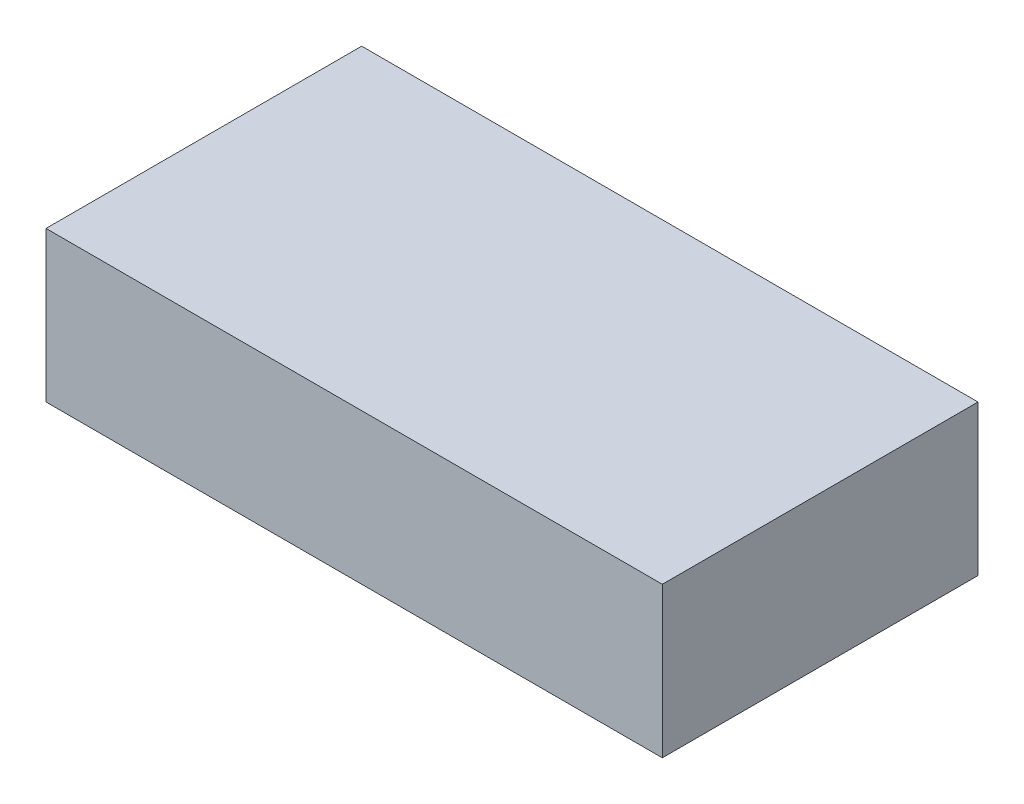
ISO-10303-21;
HEADER;
FILE_DESCRIPTION(('STEP AP214'),'2;1');
FILE_NAME('part.step','',(''),(''),'','','');
FILE_SCHEMA(('AUTOMOTIVE_DESIGN { 1 0 10303 214 1 1 1 1 }'));
ENDSEC;
DATA;
#1=APPLICATION_CONTEXT('core data for automotive mechanical design processes');
#2=APPLICATION_PROTOCOL_DEFINITION('international standard','automotive_design',2000,#1);
#3=PRODUCT_CONTEXT('',#1,'mechanical');
#4=PRODUCT('Part','Part','',(#3));
#5=PRODUCT_RELATED_PRODUCT_CATEGORY('part','',(#4));
#6=PRODUCT_DEFINITION_FORMATION('','',#4);
#7=PRODUCT_DEFINITION_CONTEXT('part definition',#1,'design');
#8=PRODUCT_DEFINITION('design','',#6,#7);
#9=PRODUCT_DEFINITION_SHAPE('','',#8);
#10=(LENGTH_UNIT() NAMED_UNIT(*) SI_UNIT(.MILLI.,.METRE.));
#11=(NAMED_UNIT(*) PLANE_ANGLE_UNIT() SI_UNIT($,.RADIAN.));
#12=(NAMED_UNIT(*) SI_UNIT($,.STERADIAN.) SOLID_ANGLE_UNIT());
#13=UNCERTAINTY_MEASURE_WITH_UNIT(LENGTH_MEASURE(1.E-05),#10,'distance_accuracy_value','');
#14=(GEOMETRIC_REPRESENTATION_CONTEXT(3) GLOBAL_UNCERTAINTY_ASSIGNED_CONTEXT((#13)) GLOBAL_UNIT_ASSIGNED_CONTEXT((#10,
#11,#12)) REPRESENTATION_CONTEXT('',''));
#15=CARTESIAN_POINT('',(0.,0.,0.));
#16=DIRECTION('',(0.,0.,1.));
#17=DIRECTION('',(1.,0.,0.));
#18=AXIS2_PLACEMENT_3D('',#15,#16,#17);
#19=CARTESIAN_POINT('',(0.,10.,0.));
#20=DIRECTION('',(1.,0.,0.));
#21=DIRECTION('',(0.,0.,-1.));
#22=AXIS2_PLACEMENT_3D('',#19,#20,#21);
#23=PLANE('',#22);
#24=DIRECTION('',(0.,0.,1.));
#25=VECTOR('',#24,1.);
#26=CARTESIAN_POINT('',(0.,0.,0.));
#27=LINE('',#26,#25);
#28=CARTESIAN_POINT('',(0.,0.,-21.));
#29=VERTEX_POINT('',#28);
#30=CARTESIAN_POINT('',(0.,0.,0.));
#31=VERTEX_POINT('',#30);
#32=EDGE_CURVE('E95',#29,#31,#27,.T.);
#33=ORIENTED_EDGE('',*,*,#32,.T.);
#34=DIRECTION('',(0.,-1.,0.));
#35=VECTOR('',#34,1.);
#36=CARTESIAN_POINT('',(0.,10.,0.));
#37=LINE('',#36,#35);
#38=CARTESIAN_POINT('',(0.,10.,0.));
#39=VERTEX_POINT('',#38);
#40=EDGE_CURVE('E11',#39,#31,#37,.T.);
#41=ORIENTED_EDGE('',*,*,#40,.F.);
#42=DIRECTION('',(0.,0.,1.));
#43=VECTOR('',#42,1.);
#44=CARTESIAN_POINT('',(0.,10.,0.));
#45=LINE('',#44,#43);
#46=CARTESIAN_POINT('',(0.,10.,-21.));
#47=VERTEX_POINT('',#46);
#48=EDGE_CURVE('E83',#47,#39,#45,.T.);
#49=ORIENTED_EDGE('',*,*,#48,.F.);
#50=DIRECTION('',(0.,-1.,0.));
#51=VECTOR('',#50,1.);
#52=CARTESIAN_POINT('',(0.,10.,-21.));
#53=LINE('',#52,#51);
#54=EDGE_CURVE('E91',#47,#29,#53,.T.);
#55=ORIENTED_EDGE('',*,*,#54,.T.);
#56=EDGE_LOOP('',(#33,#41,#49,#55));
#57=FACE_BOUND('',#56,.T.);
#58=ADVANCED_FACE('F32',(#57),#23,.F.);
#59=CARTESIAN_POINT('',(0.,10.,0.));
#60=DIRECTION('',(0.,0.,-1.));
#61=DIRECTION('',(-1.,0.,0.));
#62=AXIS2_PLACEMENT_3D('',#59,#60,#61);
#63=PLANE('',#62);
#64=DIRECTION('',(1.,0.,0.));
#65=VECTOR('',#64,1.);
#66=CARTESIAN_POINT('',(0.,0.,0.));
#67=LINE('',#66,#65);
#68=CARTESIAN_POINT('',(41.,0.,0.));
#69=VERTEX_POINT('',#68);
#70=EDGE_CURVE('E87',#31,#69,#67,.T.);
#71=ORIENTED_EDGE('',*,*,#70,.T.);
#72=DIRECTION('',(0.,-1.,0.));
#73=VECTOR('',#72,1.);
#74=CARTESIAN_POINT('',(41.,10.,0.));
#75=LINE('',#74,#73);
#76=CARTESIAN_POINT('',(41.,10.,0.));
#77=VERTEX_POINT('',#76);
#78=EDGE_CURVE('E40',#77,#69,#75,.T.);
#79=ORIENTED_EDGE('',*,*,#78,.F.);
#80=DIRECTION('',(1.,0.,0.));
#81=VECTOR('',#80,1.);
#82=CARTESIAN_POINT('',(0.,10.,0.));
#83=LINE('',#82,#81);
#84=EDGE_CURVE('E78',#39,#77,#83,.T.);
#85=ORIENTED_EDGE('',*,*,#84,.F.);
#86=ORIENTED_EDGE('',*,*,#40,.T.);
#87=EDGE_LOOP('',(#71,#79,#85,#86));
#88=FACE_BOUND('',#87,.T.);
#89=ADVANCED_FACE('F86',(#88),#63,.F.);
#90=CARTESIAN_POINT('',(41.,10.,0.));
#91=DIRECTION('',(-1.,0.,0.));
#92=DIRECTION('',(0.,0.,1.));
#93=AXIS2_PLACEMENT_3D('',#90,#91,#92);
#94=PLANE('',#93);
#95=DIRECTION('',(0.,0.,-1.));
#96=VECTOR('',#95,1.);
#97=CARTESIAN_POINT('',(41.,0.,0.));
#98=LINE('',#97,#96);
#99=CARTESIAN_POINT('',(41.,0.,-21.));
#100=VERTEX_POINT('',#99);
#101=EDGE_CURVE('E65',#69,#100,#98,.T.);
#102=ORIENTED_EDGE('',*,*,#101,.T.);
#103=DIRECTION('',(0.,-1.,0.));
#104=VECTOR('',#103,1.);
#105=CARTESIAN_POINT('',(41.,10.,-21.));
#106=LINE('',#105,#104);
#107=CARTESIAN_POINT('',(41.,10.,-21.));
#108=VERTEX_POINT('',#107);
#109=EDGE_CURVE('E88',#108,#100,#106,.T.);
#110=ORIENTED_EDGE('',*,*,#109,.F.);
#111=DIRECTION('',(0.,0.,-1.));
#112=VECTOR('',#111,1.);
#113=CARTESIAN_POINT('',(41.,10.,0.));
#114=LINE('',#113,#112);
#115=EDGE_CURVE('E81',#77,#108,#114,.T.);
#116=ORIENTED_EDGE('',*,*,#115,.F.);
#117=ORIENTED_EDGE('',*,*,#78,.T.);
#118=EDGE_LOOP('',(#102,#110,#116,#117));
#119=FACE_BOUND('',#118,.T.);
#120=ADVANCED_FACE('F89',(#119),#94,.F.);
#121=CARTESIAN_POINT('',(0.,10.,-21.));
#122=DIRECTION('',(0.,0.,1.));
#123=DIRECTION('',(1.,0.,0.));
#124=AXIS2_PLACEMENT_3D('',#121,#122,#123);
#125=PLANE('',#124);
#126=DIRECTION('',(-1.,0.,0.));
#127=VECTOR('',#126,1.);
#128=CARTESIAN_POINT('',(0.,0.,-21.));
#129=LINE('',#128,#127);
#130=EDGE_CURVE('E71',#100,#29,#129,.T.);
#131=ORIENTED_EDGE('',*,*,#130,.T.);
#132=ORIENTED_EDGE('',*,*,#54,.F.);
#133=DIRECTION('',(-1.,0.,0.));
#134=VECTOR('',#133,1.);
#135=CARTESIAN_POINT('',(0.,10.,-21.));
#136=LINE('',#135,#134);
#137=EDGE_CURVE('E48',#108,#47,#136,.T.);
#138=ORIENTED_EDGE('',*,*,#137,.F.);
#139=ORIENTED_EDGE('',*,*,#109,.T.);
#140=EDGE_LOOP('',(#131,#132,#138,#139));
#141=FACE_BOUND('',#140,.T.);
#142=ADVANCED_FACE('F102',(#141),#125,.F.);
#143=CARTESIAN_POINT('',(0.,10.,0.));
#144=DIRECTION('',(0.,-1.,0.));
#145=DIRECTION('',(0.,0.,-1.));
#146=AXIS2_PLACEMENT_3D('',#143,#144,#145);
#147=PLANE('',#146);
#148=ORIENTED_EDGE('',*,*,#48,.T.);
#149=ORIENTED_EDGE('',*,*,#84,.T.);
#150=ORIENTED_EDGE('',*,*,#115,.T.);
#151=ORIENTED_EDGE('',*,*,#137,.T.);
#152=EDGE_LOOP('',(#148,#149,#150,#151));
#153=FACE_BOUND('',#152,.T.);
#154=ADVANCED_FACE('F79',(#153),#147,.F.);
#155=CARTESIAN_POINT('',(0.,0.,0.));
#156=DIRECTION('',(0.,-1.,0.));
#157=DIRECTION('',(0.,0.,-1.));
#158=AXIS2_PLACEMENT_3D('',#155,#156,#157);
#159=PLANE('',#158);
#160=ORIENTED_EDGE('',*,*,#32,.F.);
#161=ORIENTED_EDGE('',*,*,#130,.F.);
#162=ORIENTED_EDGE('',*,*,#101,.F.);
#163=ORIENTED_EDGE('',*,*,#70,.F.);
#164=EDGE_LOOP('',(#160,#161,#162,#163));
#165=FACE_BOUND('',#164,.T.);
#166=ADVANCED_FACE('F105',(#165),#159,.T.);
#167=CLOSED_SHELL('',(#58,#89,#120,#142,#154,#166));
#168=MANIFOLD_SOLID_BREP('B2',#167);
#169=ADVANCED_BREP_SHAPE_REPRESENTATION('',(#18,#168),#14);
#170=SHAPE_DEFINITION_REPRESENTATION(#9,#169);
ENDSEC;
END-ISO-10303-21;
